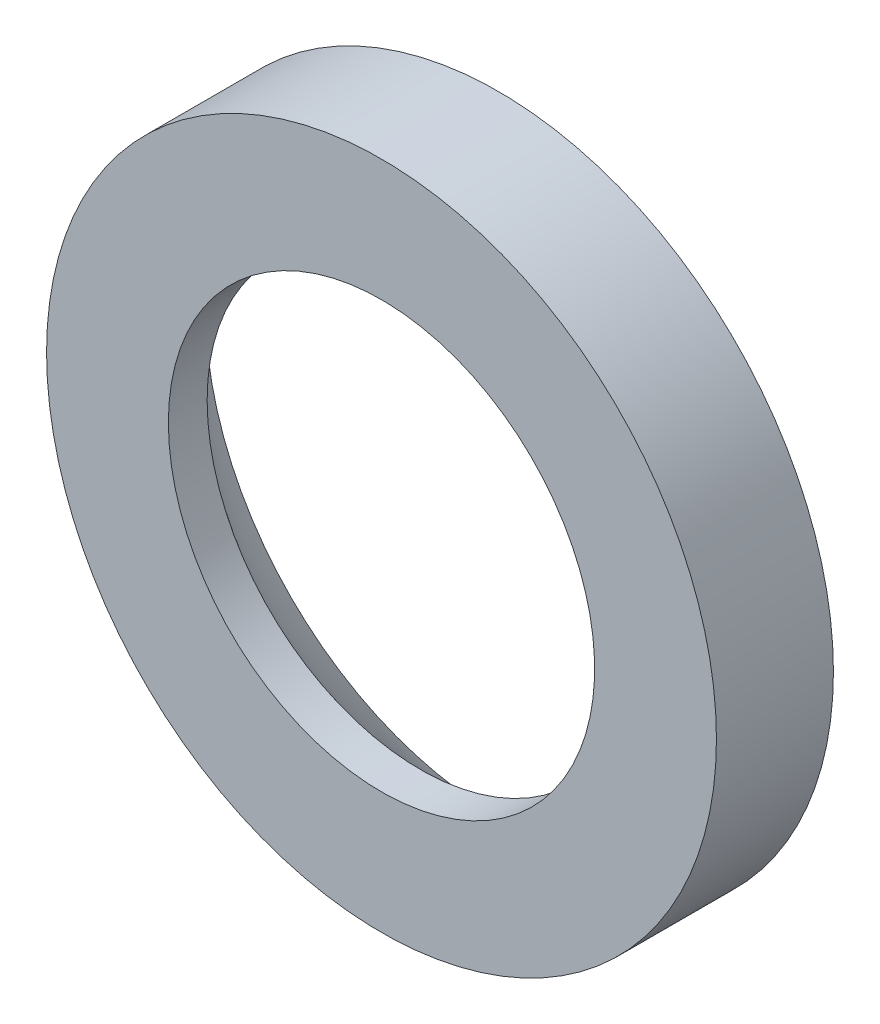
ISO-10303-21;
HEADER;
FILE_DESCRIPTION(('STEP AP214'),'2;1');
FILE_NAME('part.step','',(''),(''),'','','');
FILE_SCHEMA(('AUTOMOTIVE_DESIGN { 1 0 10303 214 1 1 1 1 }'));
ENDSEC;
DATA;
#1=APPLICATION_CONTEXT('core data for automotive mechanical design processes');
#2=APPLICATION_PROTOCOL_DEFINITION('international standard','automotive_design',2000,#1);
#3=PRODUCT_CONTEXT('',#1,'mechanical');
#4=PRODUCT('Part','Part','',(#3));
#5=PRODUCT_RELATED_PRODUCT_CATEGORY('part','',(#4));
#6=PRODUCT_DEFINITION_FORMATION('','',#4);
#7=PRODUCT_DEFINITION_CONTEXT('part definition',#1,'design');
#8=PRODUCT_DEFINITION('design','',#6,#7);
#9=PRODUCT_DEFINITION_SHAPE('','',#8);
#10=(LENGTH_UNIT() NAMED_UNIT(*) SI_UNIT(.MILLI.,.METRE.));
#11=(NAMED_UNIT(*) PLANE_ANGLE_UNIT() SI_UNIT($,.RADIAN.));
#12=(NAMED_UNIT(*) SI_UNIT($,.STERADIAN.) SOLID_ANGLE_UNIT());
#13=UNCERTAINTY_MEASURE_WITH_UNIT(LENGTH_MEASURE(1.E-05),#10,'distance_accuracy_value','');
#14=(GEOMETRIC_REPRESENTATION_CONTEXT(3) GLOBAL_UNCERTAINTY_ASSIGNED_CONTEXT((#13)) GLOBAL_UNIT_ASSIGNED_CONTEXT((#10,
#11,#12)) REPRESENTATION_CONTEXT('',''));
#15=CARTESIAN_POINT('',(0.,0.,0.));
#16=DIRECTION('',(0.,0.,1.));
#17=DIRECTION('',(1.,0.,0.));
#18=AXIS2_PLACEMENT_3D('',#15,#16,#17);
#19=CARTESIAN_POINT('',(0.,0.,-15.));
#20=DIRECTION('',(0.,0.,-1.));
#21=DIRECTION('',(-1.,0.,0.));
#22=AXIS2_PLACEMENT_3D('',#19,#20,#21);
#23=CYLINDRICAL_SURFACE('',#22,2.66);
#24=CARTESIAN_POINT('',(0.,0.,3.71608665130403));
#25=DIRECTION('',(0.,0.,-1.));
#26=DIRECTION('',(-1.,0.,0.));
#27=AXIS2_PLACEMENT_3D('',#24,#25,#26);
#28=CIRCLE('',#27,2.66);
#29=CARTESIAN_POINT('',(0.,2.66,3.71608665130403));
#30=VERTEX_POINT('',#29);
#31=EDGE_CURVE('E10',#30,#30,#28,.T.);
#32=ORIENTED_EDGE('',*,*,#31,.T.);
#33=EDGE_LOOP('',(#32));
#34=FACE_BOUND('',#33,.T.);
#35=CARTESIAN_POINT('',(0.,0.,4.2));
#36=DIRECTION('',(0.,0.,-1.));
#37=DIRECTION('',(-1.,0.,0.));
#38=AXIS2_PLACEMENT_3D('',#35,#36,#37);
#39=CIRCLE('',#38,2.66);
#40=CARTESIAN_POINT('',(-2.66,0.,4.2));
#41=VERTEX_POINT('',#40);
#42=EDGE_CURVE('E59',#41,#41,#39,.T.);
#43=ORIENTED_EDGE('',*,*,#42,.F.);
#44=EDGE_LOOP('',(#43));
#45=FACE_BOUND('',#44,.T.);
#46=ADVANCED_FACE('F39',(#34,#45),#23,.F.);
#47=CARTESIAN_POINT('',(0.,0.,0.));
#48=DIRECTION('',(0.,0.,-1.));
#49=DIRECTION('',(0.,1.,0.));
#50=AXIS2_PLACEMENT_3D('',#47,#48,#49);
#51=SPHERICAL_SURFACE('',#50,4.56999999999998);
#52=CARTESIAN_POINT('',(0.,0.,2.74));
#53=DIRECTION('',(0.,0.,-1.));
#54=DIRECTION('',(-1.,0.,0.));
#55=AXIS2_PLACEMENT_3D('',#52,#53,#54);
#56=CIRCLE('',#55,3.65749914559115);
#57=CARTESIAN_POINT('',(0.,3.65749914559115,2.74));
#58=VERTEX_POINT('',#57);
#59=EDGE_CURVE('E44',#58,#58,#56,.T.);
#60=CARTESIAN_POINT('',(0.,3.65749914559115,2.74));
#61=CARTESIAN_POINT('',(0.,3.64874866625074,2.75168061359234));
#62=CARTESIAN_POINT('',(0.,3.63994222839615,2.76331930605291));
#63=CARTESIAN_POINT('',(0.,3.62221825205674,2.78651178652534));
#64=CARTESIAN_POINT('',(0.,3.61330071357192,2.79806557453721));
#65=CARTESIAN_POINT('',(0.,3.59535535237017,2.82108718392703));
#66=CARTESIAN_POINT('',(0.,3.58632752965324,2.832555005305));
#67=CARTESIAN_POINT('',(0.,3.5681624292411,2.85540362922111));
#68=CARTESIAN_POINT('',(0.,3.55902515154588,2.86678443175926));
#69=CARTESIAN_POINT('',(0.,3.54064197974582,2.88945797321783));
#70=CARTESIAN_POINT('',(0.,3.53139608564097,2.90075071213826));
#71=CARTESIAN_POINT('',(0.,3.51279652975657,2.92324708981692));
#72=CARTESIAN_POINT('',(0.,3.503442867977,2.93445072857516));
#73=CARTESIAN_POINT('',(0.,3.48462863531762,2.9567678775234));
#74=CARTESIAN_POINT('',(0.,3.4751680644378,2.96788138771341));
#75=CARTESIAN_POINT('',(0.,3.45614088197982,2.99001725940296));
#76=CARTESIAN_POINT('',(0.,3.44657427040166,3.00103962090251));
#77=CARTESIAN_POINT('',(0.,3.42733588467872,3.02299218345268));
#78=CARTESIAN_POINT('',(0.,3.41766411053396,3.03392238450331));
#79=CARTESIAN_POINT('',(0.,3.39821628746359,3.05568962285749));
#80=CARTESIAN_POINT('',(0.,3.38844023853799,3.06652666016105));
#81=CARTESIAN_POINT('',(0.,3.368784763263,3.08810657627438));
#82=CARTESIAN_POINT('',(0.,3.3589053369136,3.09884945508414));
#83=CARTESIAN_POINT('',(0.,3.33904401363727,3.12024006810615));
#84=CARTESIAN_POINT('',(0.,3.32906211671033,3.13088780231839));
#85=CARTESIAN_POINT('',(0.,3.30899676853108,3.15208714877505));
#86=CARTESIAN_POINT('',(0.,3.29891331727876,3.16263876101947));
#87=CARTESIAN_POINT('',(0.,3.27864578602273,3.18364489499337));
#88=CARTESIAN_POINT('',(0.,3.268461706019,3.19409941672286));
#89=CARTESIAN_POINT('',(0.,3.24799385207098,3.21491041003184));
#90=CARTESIAN_POINT('',(0.,3.23771007812668,3.22526688161133));
#91=CARTESIAN_POINT('',(0.,3.21704378025936,3.24588082398546));
#92=CARTESIAN_POINT('',(0.,3.20666125633635,3.25613829478008));
#93=CARTESIAN_POINT('',(0.,3.18579841153789,3.27655329403698));
#94=CARTESIAN_POINT('',(0.,3.17531809066244,3.28671082249926));
#95=CARTESIAN_POINT('',(0.,3.15426061396228,3.30692500471786));
#96=CARTESIAN_POINT('',(0.,3.14368345813758,3.31698165847417));
#97=CARTESIAN_POINT('',(0.,3.12243328243072,3.33699316816664));
#98=CARTESIAN_POINT('',(0.,3.11176026254857,3.3469480241028));
#99=CARTESIAN_POINT('',(0.,3.0903193384181,3.36675502438491));
#100=CARTESIAN_POINT('',(0.,3.07955143416979,3.37660716873087));
#101=CARTESIAN_POINT('',(0.,3.05792172970788,3.39620784149061));
#102=CARTESIAN_POINT('',(0.,3.04705992949427,3.40595636990439));
#103=CARTESIAN_POINT('',(0.,3.02524343012148,3.42534891596882));
#104=CARTESIAN_POINT('',(0.,3.01428873096229,3.43499293361947));
#105=CARTESIAN_POINT('',(0.,2.99228743924534,3.45417557291989));
#106=CARTESIAN_POINT('',(0.,2.98124084668759,3.46371419456965));
#107=CARTESIAN_POINT('',(0.,2.95905678215559,3.48268516630503));
#108=CARTESIAN_POINT('',(0.,2.94791931018136,3.49211751639065));
#109=CARTESIAN_POINT('',(0.,2.92555450914025,3.51087507918903));
#110=CARTESIAN_POINT('',(0.,2.91432718007337,3.52020029190179));
#111=CARTESIAN_POINT('',(0.,2.89178369541968,3.53874272398106));
#112=CARTESIAN_POINT('',(0.,2.88046753983286,3.54795994334758));
#113=CARTESIAN_POINT('',(0.,2.8577474408627,3.56628554266997));
#114=CARTESIAN_POINT('',(0.,2.84634349747934,3.57539392262586));
#115=CARTESIAN_POINT('',(0.,2.82344886970812,3.59350100706747));
#116=CARTESIAN_POINT('',(0.,2.81195818532026,3.6024997115532));
#117=CARTESIAN_POINT('',(0.,2.78889113025509,3.62038661900879));
#118=CARTESIAN_POINT('',(0.,2.77731475957779,3.62927482197865));
#119=CARTESIAN_POINT('',(0.,2.75407739465973,3.6469399106993));
#120=CARTESIAN_POINT('',(0.,2.74241640041898,3.65571679645008));
#121=CARTESIAN_POINT('',(0.,2.71901085832417,3.67315844450316));
#122=CARTESIAN_POINT('',(0.,2.70726631047012,3.68182320680545));
#123=CARTESIAN_POINT('',(0.,2.68369474079688,3.69903981480132));
#124=CARTESIAN_POINT('',(0.,2.67186771897769,3.70759166049491));
#125=CARTESIAN_POINT('',(0.,2.66,3.71608665130403));
#126=B_SPLINE_CURVE_WITH_KNOTS('',3,(#60,#61,#62,#63,#64,#65,#66,#67,#68,#69,#70,#71,#72,#73,
#74,#75,#76,#77,#78,#79,#80,#81,#82,#83,#84,#85,#86,#87,#88,#89,#90,#91,#92,#93,#94,#95,#96,#97,
#98,#99,#100,#101,#102,#103,#104,#105,#106,#107,#108,#109,#110,#111,#112,#113,#114,#115,#116,
#117,#118,#119,#120,#121,#122,#123,#124,#125),.UNSPECIFIED.,.F.,.F.,(4,2,2,2,2,2,2,2,2,2,2,2,2,
2,2,2,2,2,2,2,2,2,2,2,2,2,2,2,2,2,2,2,4),(0.,0.0437841744622149,0.0875683489244293,
0.131352523386645,0.175136697848859,0.218920872311074,0.262705046773289,0.306489221235504,
0.350273395697719,0.394057570159934,0.437841744622149,0.481625919084364,0.525410093546578,
0.569194268008794,0.612978442471008,0.656762616933224,0.700546791395438,0.744330965857653,
0.788115140319868,0.831899314782083,0.875683489244297,0.919467663706512,0.963251838168727,
1.00703601263094,1.05082018709316,1.09460436155537,1.13838853601759,1.1821727104798,
1.22595688494202,1.26974105940423,1.31352523386645,1.35730940832866,1.40109358279088),.UNSPECIFIED.);
#127=EDGE_CURVE('BSEAM67',#58,#30,#126,.T.);
#128=ORIENTED_EDGE('',*,*,#59,.T.);
#129=ORIENTED_EDGE('',*,*,#31,.F.);
#130=ORIENTED_EDGE('',*,*,#127,.T.);
#131=ORIENTED_EDGE('',*,*,#127,.F.);
#132=EDGE_LOOP('',(#128,#130,#129,#131));
#133=FACE_BOUND('',#132,.T.);
#134=ADVANCED_FACE('F67',(#133),#51,.F.);
#135=CARTESIAN_POINT('',(0.,4.18,2.74));
#136=DIRECTION('',(0.,0.,-1.));
#137=DIRECTION('',(-1.,0.,0.));
#138=AXIS2_PLACEMENT_3D('',#135,#136,#137);
#139=PLANE('',#138);
#140=CARTESIAN_POINT('',(0.,0.,2.74));
#141=DIRECTION('',(0.,0.,-1.));
#142=DIRECTION('',(-1.,0.,0.));
#143=AXIS2_PLACEMENT_3D('',#140,#141,#142);
#144=CIRCLE('',#143,4.18);
#145=CARTESIAN_POINT('',(-4.18,0.,2.74));
#146=VERTEX_POINT('',#145);
#147=EDGE_CURVE('E47',#146,#146,#144,.T.);
#148=ORIENTED_EDGE('',*,*,#147,.T.);
#149=EDGE_LOOP('',(#148));
#150=FACE_BOUND('',#149,.T.);
#151=ORIENTED_EDGE('',*,*,#59,.F.);
#152=EDGE_LOOP('',(#151));
#153=FACE_BOUND('',#152,.T.);
#154=ADVANCED_FACE('F68',(#150,#153),#139,.T.);
#155=CARTESIAN_POINT('',(0.,0.,-15.));
#156=DIRECTION('',(0.,0.,-1.));
#157=DIRECTION('',(-1.,0.,0.));
#158=AXIS2_PLACEMENT_3D('',#155,#156,#157);
#159=CYLINDRICAL_SURFACE('',#158,4.18);
#160=CARTESIAN_POINT('',(0.,0.,4.2));
#161=DIRECTION('',(0.,0.,-1.));
#162=DIRECTION('',(-1.,0.,0.));
#163=AXIS2_PLACEMENT_3D('',#160,#161,#162);
#164=CIRCLE('',#163,4.18);
#165=CARTESIAN_POINT('',(-4.18,0.,4.2));
#166=VERTEX_POINT('',#165);
#167=EDGE_CURVE('E52',#166,#166,#164,.T.);
#168=ORIENTED_EDGE('',*,*,#167,.T.);
#169=EDGE_LOOP('',(#168));
#170=FACE_BOUND('',#169,.T.);
#171=ORIENTED_EDGE('',*,*,#147,.F.);
#172=EDGE_LOOP('',(#171));
#173=FACE_BOUND('',#172,.T.);
#174=ADVANCED_FACE('F74',(#170,#173),#159,.T.);
#175=CARTESIAN_POINT('',(0.,2.66,4.2));
#176=DIRECTION('',(0.,0.,1.));
#177=DIRECTION('',(1.,0.,0.));
#178=AXIS2_PLACEMENT_3D('',#175,#176,#177);
#179=PLANE('',#178);
#180=ORIENTED_EDGE('',*,*,#42,.T.);
#181=EDGE_LOOP('',(#180));
#182=FACE_BOUND('',#181,.T.);
#183=ORIENTED_EDGE('',*,*,#167,.F.);
#184=EDGE_LOOP('',(#183));
#185=FACE_BOUND('',#184,.T.);
#186=ADVANCED_FACE('F65',(#182,#185),#179,.T.);
#187=CLOSED_SHELL('',(#46,#134,#154,#174,#186));
#188=MANIFOLD_SOLID_BREP('B2',#187);
#189=ADVANCED_BREP_SHAPE_REPRESENTATION('',(#18,#188),#14);
#190=SHAPE_DEFINITION_REPRESENTATION(#9,#189);
ENDSEC;
END-ISO-10303-21;
